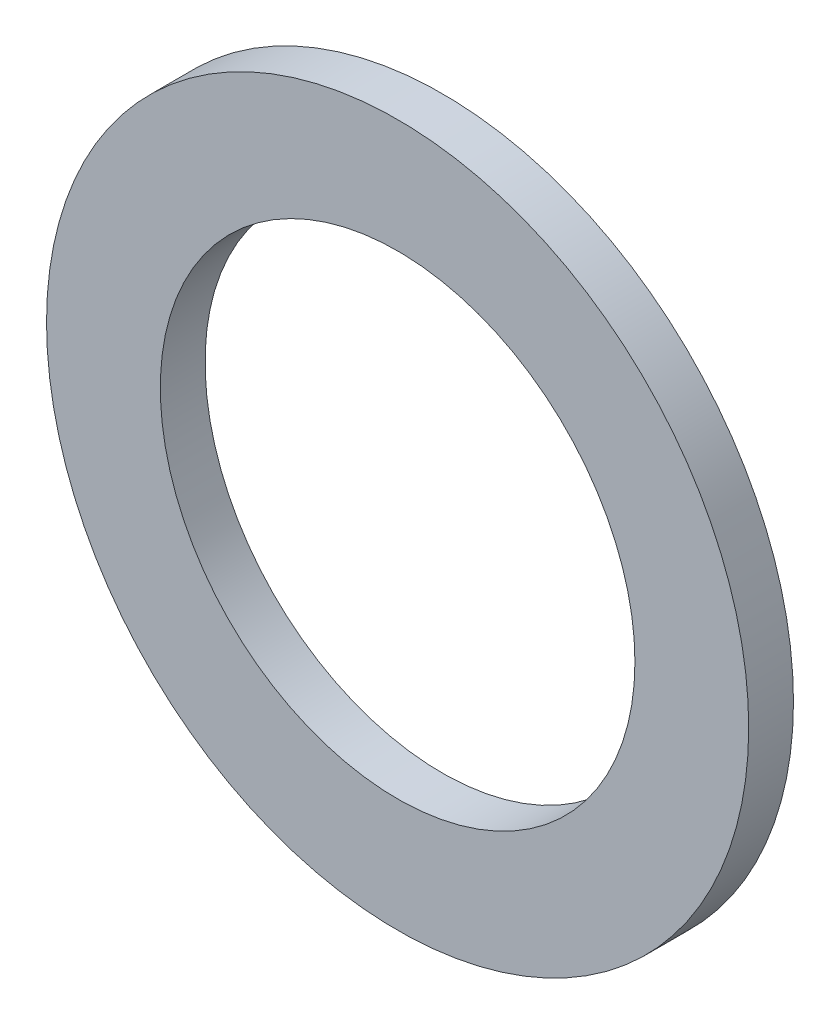
ISO-10303-21;
HEADER;
FILE_DESCRIPTION(('STEP AP214'),'2;1');
FILE_NAME('part.step','',(''),(''),'','','');
FILE_SCHEMA(('AUTOMOTIVE_DESIGN { 1 0 10303 214 1 1 1 1 }'));
ENDSEC;
DATA;
#1=APPLICATION_CONTEXT('core data for automotive mechanical design processes');
#2=APPLICATION_PROTOCOL_DEFINITION('international standard','automotive_design',2000,#1);
#3=PRODUCT_CONTEXT('',#1,'mechanical');
#4=PRODUCT('Part','Part','',(#3));
#5=PRODUCT_RELATED_PRODUCT_CATEGORY('part','',(#4));
#6=PRODUCT_DEFINITION_FORMATION('','',#4);
#7=PRODUCT_DEFINITION_CONTEXT('part definition',#1,'design');
#8=PRODUCT_DEFINITION('design','',#6,#7);
#9=PRODUCT_DEFINITION_SHAPE('','',#8);
#10=(LENGTH_UNIT() NAMED_UNIT(*) SI_UNIT(.MILLI.,.METRE.));
#11=(NAMED_UNIT(*) PLANE_ANGLE_UNIT() SI_UNIT($,.RADIAN.));
#12=(NAMED_UNIT(*) SI_UNIT($,.STERADIAN.) SOLID_ANGLE_UNIT());
#13=UNCERTAINTY_MEASURE_WITH_UNIT(LENGTH_MEASURE(1.E-05),#10,'distance_accuracy_value','');
#14=(GEOMETRIC_REPRESENTATION_CONTEXT(3) GLOBAL_UNCERTAINTY_ASSIGNED_CONTEXT((#13)) GLOBAL_UNIT_ASSIGNED_CONTEXT((#10,
#11,#12)) REPRESENTATION_CONTEXT('',''));
#15=CARTESIAN_POINT('',(0.,0.,0.));
#16=DIRECTION('',(0.,0.,1.));
#17=DIRECTION('',(1.,0.,0.));
#18=AXIS2_PLACEMENT_3D('',#15,#16,#17);
#19=CARTESIAN_POINT('',(0.,0.,5.));
#20=DIRECTION('',(0.,0.,1.));
#21=DIRECTION('',(1.,0.,0.));
#22=AXIS2_PLACEMENT_3D('',#19,#20,#21);
#23=PLANE('',#22);
#24=CARTESIAN_POINT('',(0.,0.,5.));
#25=DIRECTION('',(0.,0.,1.));
#26=DIRECTION('',(1.,0.,0.));
#27=AXIS2_PLACEMENT_3D('',#24,#25,#26);
#28=CIRCLE('',#27,39.22);
#29=CARTESIAN_POINT('',(39.22,0.,5.));
#30=VERTEX_POINT('',#29);
#31=EDGE_CURVE('E10',#30,#30,#28,.T.);
#32=ORIENTED_EDGE('',*,*,#31,.T.);
#33=EDGE_LOOP('',(#32));
#34=FACE_BOUND('',#33,.T.);
#35=CARTESIAN_POINT('',(0.,0.,5.));
#36=DIRECTION('',(0.,0.,1.));
#37=DIRECTION('',(1.,0.,0.));
#38=AXIS2_PLACEMENT_3D('',#35,#36,#37);
#39=CIRCLE('',#38,26.51);
#40=CARTESIAN_POINT('',(26.51,0.,5.));
#41=VERTEX_POINT('',#40);
#42=EDGE_CURVE('E42',#41,#41,#39,.T.);
#43=ORIENTED_EDGE('',*,*,#42,.F.);
#44=EDGE_LOOP('',(#43));
#45=FACE_BOUND('',#44,.T.);
#46=ADVANCED_FACE('F31',(#34,#45),#23,.T.);
#47=CARTESIAN_POINT('',(0.,0.,0.));
#48=DIRECTION('',(0.,0.,1.));
#49=DIRECTION('',(1.,0.,0.));
#50=AXIS2_PLACEMENT_3D('',#47,#48,#49);
#51=PLANE('',#50);
#52=CARTESIAN_POINT('',(0.,0.,0.));
#53=DIRECTION('',(0.,0.,1.));
#54=DIRECTION('',(1.,0.,0.));
#55=AXIS2_PLACEMENT_3D('',#52,#53,#54);
#56=CIRCLE('',#55,39.22);
#57=CARTESIAN_POINT('',(39.22,0.,0.));
#58=VERTEX_POINT('',#57);
#59=EDGE_CURVE('E35',#58,#58,#56,.T.);
#60=ORIENTED_EDGE('',*,*,#59,.F.);
#61=EDGE_LOOP('',(#60));
#62=FACE_BOUND('',#61,.T.);
#63=CARTESIAN_POINT('',(0.,0.,0.));
#64=DIRECTION('',(0.,0.,1.));
#65=DIRECTION('',(1.,0.,0.));
#66=AXIS2_PLACEMENT_3D('',#63,#64,#65);
#67=CIRCLE('',#66,26.51);
#68=CARTESIAN_POINT('',(26.51,0.,0.));
#69=VERTEX_POINT('',#68);
#70=EDGE_CURVE('E44',#69,#69,#67,.T.);
#71=ORIENTED_EDGE('',*,*,#70,.T.);
#72=EDGE_LOOP('',(#71));
#73=FACE_BOUND('',#72,.T.);
#74=ADVANCED_FACE('F54',(#62,#73),#51,.F.);
#75=CARTESIAN_POINT('',(0.,0.,5.));
#76=DIRECTION('',(0.,0.,-1.));
#77=DIRECTION('',(-1.,0.,0.));
#78=AXIS2_PLACEMENT_3D('',#75,#76,#77);
#79=CYLINDRICAL_SURFACE('',#78,39.22);
#80=ORIENTED_EDGE('',*,*,#31,.F.);
#81=EDGE_LOOP('',(#80));
#82=FACE_BOUND('',#81,.T.);
#83=ORIENTED_EDGE('',*,*,#59,.T.);
#84=EDGE_LOOP('',(#83));
#85=FACE_BOUND('',#84,.T.);
#86=ADVANCED_FACE('F33',(#82,#85),#79,.T.);
#87=CARTESIAN_POINT('',(0.,0.,5.));
#88=DIRECTION('',(0.,0.,-1.));
#89=DIRECTION('',(-1.,0.,0.));
#90=AXIS2_PLACEMENT_3D('',#87,#88,#89);
#91=CYLINDRICAL_SURFACE('',#90,26.51);
#92=ORIENTED_EDGE('',*,*,#42,.T.);
#93=EDGE_LOOP('',(#92));
#94=FACE_BOUND('',#93,.T.);
#95=ORIENTED_EDGE('',*,*,#70,.F.);
#96=EDGE_LOOP('',(#95));
#97=FACE_BOUND('',#96,.T.);
#98=ADVANCED_FACE('F50',(#94,#97),#91,.F.);
#99=CLOSED_SHELL('',(#46,#74,#86,#98));
#100=MANIFOLD_SOLID_BREP('B2',#99);
#101=ADVANCED_BREP_SHAPE_REPRESENTATION('',(#18,#100),#14);
#102=SHAPE_DEFINITION_REPRESENTATION(#9,#101);
ENDSEC;
END-ISO-10303-21;
